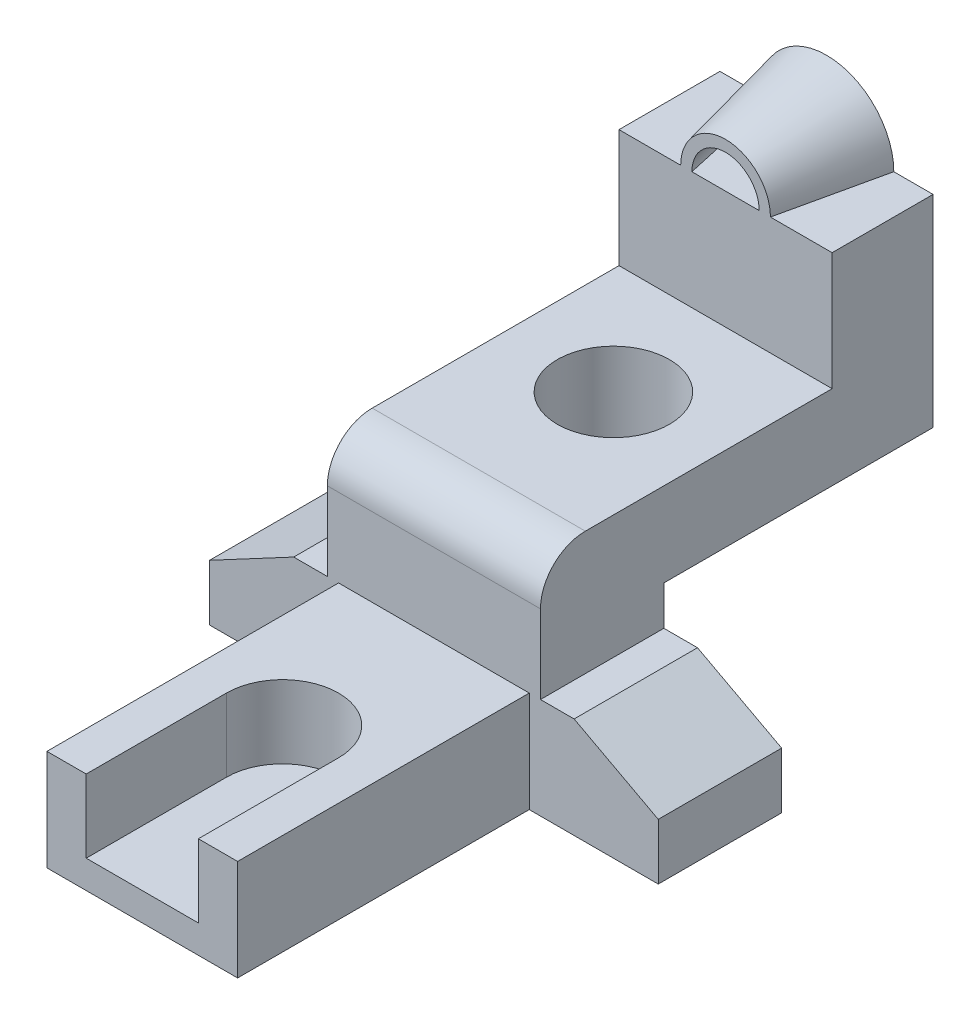
ISO-10303-21;
HEADER;
FILE_DESCRIPTION(('STEP AP214'),'2;1');
FILE_NAME('part.step','',(''),(''),'','','');
FILE_SCHEMA(('AUTOMOTIVE_DESIGN { 1 0 10303 214 1 1 1 1 }'));
ENDSEC;
DATA;
#1=APPLICATION_CONTEXT('core data for automotive mechanical design processes');
#2=APPLICATION_PROTOCOL_DEFINITION('international standard','automotive_design',2000,#1);
#3=PRODUCT_CONTEXT('',#1,'mechanical');
#4=PRODUCT('Part','Part','',(#3));
#5=PRODUCT_RELATED_PRODUCT_CATEGORY('part','',(#4));
#6=PRODUCT_DEFINITION_FORMATION('','',#4);
#7=PRODUCT_DEFINITION_CONTEXT('part definition',#1,'design');
#8=PRODUCT_DEFINITION('design','',#6,#7);
#9=PRODUCT_DEFINITION_SHAPE('','',#8);
#10=(LENGTH_UNIT() NAMED_UNIT(*) SI_UNIT(.MILLI.,.METRE.));
#11=(NAMED_UNIT(*) PLANE_ANGLE_UNIT() SI_UNIT($,.RADIAN.));
#12=(NAMED_UNIT(*) SI_UNIT($,.STERADIAN.) SOLID_ANGLE_UNIT());
#13=UNCERTAINTY_MEASURE_WITH_UNIT(LENGTH_MEASURE(1.E-05),#10,'distance_accuracy_value','');
#14=(GEOMETRIC_REPRESENTATION_CONTEXT(3) GLOBAL_UNCERTAINTY_ASSIGNED_CONTEXT((#13)) GLOBAL_UNIT_ASSIGNED_CONTEXT((#10,
#11,#12)) REPRESENTATION_CONTEXT('',''));
#15=CARTESIAN_POINT('',(0.,0.,0.));
#16=DIRECTION('',(0.,0.,1.));
#17=DIRECTION('',(1.,0.,0.));
#18=AXIS2_PLACEMENT_3D('',#15,#16,#17);
#19=CARTESIAN_POINT('',(40.,61.,-52.));
#20=DIRECTION('',(0.,-1.,0.));
#21=DIRECTION('',(0.,0.,-1.));
#22=AXIS2_PLACEMENT_3D('',#19,#20,#21);
#23=PLANE('',#22);
#24=DIRECTION('',(-1.,0.,0.));
#25=VECTOR('',#24,1.);
#26=CARTESIAN_POINT('',(40.,61.,-70.));
#27=LINE('',#26,#25);
#28=CARTESIAN_POINT('',(10.,61.,-70.));
#29=VERTEX_POINT('',#28);
#30=CARTESIAN_POINT('',(-10.,61.,-70.));
#31=VERTEX_POINT('',#30);
#32=EDGE_CURVE('E257',#29,#31,#27,.T.);
#33=ORIENTED_EDGE('',*,*,#32,.T.);
#34=DIRECTION('',(-0.216930457818657,0.,-0.976187060183953));
#35=VECTOR('',#34,1.);
#36=CARTESIAN_POINT('',(0.,61.,-25.0000000000001));
#37=LINE('',#36,#35);
#38=CARTESIAN_POINT('',(-6.,61.,-52.));
#39=VERTEX_POINT('',#38);
#40=EDGE_CURVE('E473',#31,#39,#37,.F.);
#41=ORIENTED_EDGE('',*,*,#40,.T.);
#42=DIRECTION('',(-1.,0.,0.));
#43=VECTOR('',#42,1.);
#44=CARTESIAN_POINT('',(40.,61.,-52.));
#45=LINE('',#44,#43);
#46=CARTESIAN_POINT('',(6.,61.,-52.));
#47=VERTEX_POINT('',#46);
#48=EDGE_CURVE('E272',#47,#39,#45,.T.);
#49=ORIENTED_EDGE('',*,*,#48,.F.);
#50=DIRECTION('',(-0.216930457818657,0.,0.976187060183953));
#51=VECTOR('',#50,1.);
#52=CARTESIAN_POINT('',(0.,61.,-25.0000000000001));
#53=LINE('',#52,#51);
#54=EDGE_CURVE('E489',#47,#29,#53,.F.);
#55=ORIENTED_EDGE('',*,*,#54,.T.);
#56=EDGE_LOOP('',(#33,#41,#49,#55));
#57=FACE_BOUND('',#56,.T.);
#58=ADVANCED_FACE('F45',(#57),#23,.F.);
#59=CARTESIAN_POINT('',(-8.,61.,-52.));
#60=VERTEX_POINT('',#59);
#61=CARTESIAN_POINT('',(-19.,61.,-52.));
#62=VERTEX_POINT('',#61);
#63=EDGE_CURVE('E273',#60,#62,#45,.T.);
#64=ORIENTED_EDGE('',*,*,#63,.F.);
#65=DIRECTION('',(-0.216930457818657,0.,-0.976187060183953));
#66=VECTOR('',#65,1.);
#67=CARTESIAN_POINT('',(0.,61.,-16.0000000000001));
#68=LINE('',#67,#66);
#69=CARTESIAN_POINT('',(-12.,61.,-70.));
#70=VERTEX_POINT('',#69);
#71=EDGE_CURVE('E237',#60,#70,#68,.T.);
#72=ORIENTED_EDGE('',*,*,#71,.T.);
#73=CARTESIAN_POINT('',(-19.,61.,-70.));
#74=VERTEX_POINT('',#73);
#75=EDGE_CURVE('E248',#70,#74,#27,.T.);
#76=ORIENTED_EDGE('',*,*,#75,.T.);
#77=DIRECTION('',(0.,0.,1.));
#78=VECTOR('',#77,1.);
#79=CARTESIAN_POINT('',(-19.,61.,-80.));
#80=LINE('',#79,#78);
#81=EDGE_CURVE('E357',#74,#62,#80,.T.);
#82=ORIENTED_EDGE('',*,*,#81,.T.);
#83=EDGE_LOOP('',(#64,#72,#76,#82));
#84=FACE_BOUND('',#83,.T.);
#85=ADVANCED_FACE('F580',(#84),#23,.F.);
#86=CARTESIAN_POINT('',(40.,0.,0.));
#87=DIRECTION('',(0.,0.,-1.));
#88=DIRECTION('',(-1.,0.,0.));
#89=AXIS2_PLACEMENT_3D('',#86,#87,#88);
#90=PLANE('',#89);
#91=DIRECTION('',(0.,-1.,0.));
#92=VECTOR('',#91,1.);
#93=CARTESIAN_POINT('',(19.,61.,0.));
#94=LINE('',#93,#92);
#95=CARTESIAN_POINT('',(19.,32.,0.));
#96=VERTEX_POINT('',#95);
#97=CARTESIAN_POINT('',(19.,18.,0.));
#98=VERTEX_POINT('',#97);
#99=EDGE_CURVE('E358',#96,#98,#94,.T.);
#100=ORIENTED_EDGE('',*,*,#99,.F.);
#101=DIRECTION('',(-1.,0.,0.));
#102=VECTOR('',#101,1.);
#103=CARTESIAN_POINT('',(40.,32.,0.));
#104=LINE('',#103,#102);
#105=CARTESIAN_POINT('',(-19.,32.,0.));
#106=VERTEX_POINT('',#105);
#107=EDGE_CURVE('E518',#96,#106,#104,.T.);
#108=ORIENTED_EDGE('',*,*,#107,.T.);
#109=DIRECTION('',(0.,1.,0.));
#110=VECTOR('',#109,1.);
#111=CARTESIAN_POINT('',(-19.,61.,0.));
#112=LINE('',#111,#110);
#113=CARTESIAN_POINT('',(-19.,18.,0.));
#114=VERTEX_POINT('',#113);
#115=EDGE_CURVE('E377',#114,#106,#112,.T.);
#116=ORIENTED_EDGE('',*,*,#115,.F.);
#117=DIRECTION('',(1.,0.,0.));
#118=VECTOR('',#117,1.);
#119=CARTESIAN_POINT('',(-40.,18.,0.));
#120=LINE('',#119,#118);
#121=CARTESIAN_POINT('',(-25.,18.,0.));
#122=VERTEX_POINT('',#121);
#123=EDGE_CURVE('E361',#122,#114,#120,.T.);
#124=ORIENTED_EDGE('',*,*,#123,.F.);
#125=DIRECTION('',(-0.882352941176471,-0.470588235294118,0.));
#126=VECTOR('',#125,1.);
#127=CARTESIAN_POINT('',(-25.,18.,0.));
#128=LINE('',#127,#126);
#129=CARTESIAN_POINT('',(-40.,10.,0.));
#130=VERTEX_POINT('',#129);
#131=EDGE_CURVE('E400',#122,#130,#128,.T.);
#132=ORIENTED_EDGE('',*,*,#131,.T.);
#133=DIRECTION('',(0.,-1.,0.));
#134=VECTOR('',#133,1.);
#135=CARTESIAN_POINT('',(-40.,0.,0.));
#136=LINE('',#135,#134);
#137=CARTESIAN_POINT('',(-40.,0.,0.));
#138=VERTEX_POINT('',#137);
#139=EDGE_CURVE('E293',#130,#138,#136,.T.);
#140=ORIENTED_EDGE('',*,*,#139,.T.);
#141=DIRECTION('',(-1.,0.,0.));
#142=VECTOR('',#141,1.);
#143=CARTESIAN_POINT('',(40.,0.,0.));
#144=LINE('',#143,#142);
#145=CARTESIAN_POINT('',(-17.,0.,0.));
#146=VERTEX_POINT('',#145);
#147=EDGE_CURVE('E290',#146,#138,#144,.T.);
#148=ORIENTED_EDGE('',*,*,#147,.F.);
#149=DIRECTION('',(0.,-1.,0.));
#150=VECTOR('',#149,1.);
#151=CARTESIAN_POINT('',(-17.,0.,0.));
#152=LINE('',#151,#150);
#153=CARTESIAN_POINT('',(-17.,18.,0.));
#154=VERTEX_POINT('',#153);
#155=EDGE_CURVE('E430',#154,#146,#152,.T.);
#156=ORIENTED_EDGE('',*,*,#155,.F.);
#157=DIRECTION('',(-1.,0.,0.));
#158=VECTOR('',#157,1.);
#159=CARTESIAN_POINT('',(-17.,18.,0.));
#160=LINE('',#159,#158);
#161=CARTESIAN_POINT('',(17.,18.,0.));
#162=VERTEX_POINT('',#161);
#163=EDGE_CURVE('E421',#162,#154,#160,.T.);
#164=ORIENTED_EDGE('',*,*,#163,.F.);
#165=DIRECTION('',(0.,1.,0.));
#166=VECTOR('',#165,1.);
#167=CARTESIAN_POINT('',(17.,0.,0.));
#168=LINE('',#167,#166);
#169=CARTESIAN_POINT('',(17.,0.,0.));
#170=VERTEX_POINT('',#169);
#171=EDGE_CURVE('E426',#170,#162,#168,.T.);
#172=ORIENTED_EDGE('',*,*,#171,.F.);
#173=CARTESIAN_POINT('',(40.,0.,0.));
#174=VERTEX_POINT('',#173);
#175=EDGE_CURVE('E286',#174,#170,#144,.T.);
#176=ORIENTED_EDGE('',*,*,#175,.F.);
#177=DIRECTION('',(0.,-1.,0.));
#178=VECTOR('',#177,1.);
#179=CARTESIAN_POINT('',(40.,0.,0.));
#180=LINE('',#179,#178);
#181=CARTESIAN_POINT('',(40.,10.,0.));
#182=VERTEX_POINT('',#181);
#183=EDGE_CURVE('E307',#182,#174,#180,.T.);
#184=ORIENTED_EDGE('',*,*,#183,.F.);
#185=DIRECTION('',(0.882352941176471,-0.470588235294118,0.));
#186=VECTOR('',#185,1.);
#187=CARTESIAN_POINT('',(25.,18.,0.));
#188=LINE('',#187,#186);
#189=CARTESIAN_POINT('',(25.,18.,0.));
#190=VERTEX_POINT('',#189);
#191=EDGE_CURVE('E391',#190,#182,#188,.T.);
#192=ORIENTED_EDGE('',*,*,#191,.F.);
#193=DIRECTION('',(1.,0.,0.));
#194=VECTOR('',#193,1.);
#195=CARTESIAN_POINT('',(40.,18.,0.));
#196=LINE('',#195,#194);
#197=EDGE_CURVE('E362',#98,#190,#196,.T.);
#198=ORIENTED_EDGE('',*,*,#197,.F.);
#199=EDGE_LOOP('',(#100,#108,#116,#124,#132,#140,#148,#156,#164,#172,#176,#184,#192,#198));
#200=FACE_BOUND('',#199,.T.);
#201=ADVANCED_FACE('F553',(#200),#90,.F.);
#202=CARTESIAN_POINT('',(40.,25.,-22.));
#203=DIRECTION('',(0.,0.,1.));
#204=DIRECTION('',(0.,-1.,0.));
#205=AXIS2_PLACEMENT_3D('',#202,#203,#204);
#206=PLANE('',#205);
#207=DIRECTION('',(-1.,0.,0.));
#208=VECTOR('',#207,1.);
#209=CARTESIAN_POINT('',(40.,0.,-22.));
#210=LINE('',#209,#208);
#211=CARTESIAN_POINT('',(40.,0.,-22.));
#212=VERTEX_POINT('',#211);
#213=CARTESIAN_POINT('',(-40.,0.,-22.));
#214=VERTEX_POINT('',#213);
#215=EDGE_CURVE('E529',#212,#214,#210,.T.);
#216=ORIENTED_EDGE('',*,*,#215,.T.);
#217=DIRECTION('',(0.,1.,0.));
#218=VECTOR('',#217,1.);
#219=CARTESIAN_POINT('',(-40.,25.,-22.));
#220=LINE('',#219,#218);
#221=CARTESIAN_POINT('',(-40.,10.,-22.));
#222=VERTEX_POINT('',#221);
#223=EDGE_CURVE('E298',#214,#222,#220,.T.);
#224=ORIENTED_EDGE('',*,*,#223,.T.);
#225=DIRECTION('',(-0.882352941176471,-0.470588235294118,0.));
#226=VECTOR('',#225,1.);
#227=CARTESIAN_POINT('',(28.5121107266436,46.5397923875432,-22.));
#228=LINE('',#227,#226);
#229=CARTESIAN_POINT('',(-25.,18.,-22.));
#230=VERTEX_POINT('',#229);
#231=EDGE_CURVE('E394',#230,#222,#228,.T.);
#232=ORIENTED_EDGE('',*,*,#231,.F.);
#233=DIRECTION('',(1.,0.,0.));
#234=VECTOR('',#233,1.);
#235=CARTESIAN_POINT('',(40.,18.,-22.));
#236=LINE('',#235,#234);
#237=CARTESIAN_POINT('',(-19.,18.,-22.));
#238=VERTEX_POINT('',#237);
#239=EDGE_CURVE('E354',#230,#238,#236,.T.);
#240=ORIENTED_EDGE('',*,*,#239,.T.);
#241=DIRECTION('',(0.,1.,0.));
#242=VECTOR('',#241,1.);
#243=CARTESIAN_POINT('',(-19.,25.,-22.));
#244=LINE('',#243,#242);
#245=CARTESIAN_POINT('',(-19.,25.,-22.));
#246=VERTEX_POINT('',#245);
#247=EDGE_CURVE('E306',#238,#246,#244,.T.);
#248=ORIENTED_EDGE('',*,*,#247,.T.);
#249=DIRECTION('',(-1.,0.,0.));
#250=VECTOR('',#249,1.);
#251=CARTESIAN_POINT('',(40.,25.,-22.));
#252=LINE('',#251,#250);
#253=CARTESIAN_POINT('',(0.,25.,-22.));
#254=VERTEX_POINT('',#253);
#255=EDGE_CURVE('E262',#254,#246,#252,.T.);
#256=ORIENTED_EDGE('',*,*,#255,.F.);
#257=CARTESIAN_POINT('',(19.,25.,-22.));
#258=VERTEX_POINT('',#257);
#259=EDGE_CURVE('E531',#258,#254,#252,.T.);
#260=ORIENTED_EDGE('',*,*,#259,.F.);
#261=DIRECTION('',(0.,-1.,0.));
#262=VECTOR('',#261,1.);
#263=CARTESIAN_POINT('',(19.,25.,-22.));
#264=LINE('',#263,#262);
#265=CARTESIAN_POINT('',(19.,18.,-22.));
#266=VERTEX_POINT('',#265);
#267=EDGE_CURVE('E333',#258,#266,#264,.T.);
#268=ORIENTED_EDGE('',*,*,#267,.T.);
#269=DIRECTION('',(1.,0.,0.));
#270=VECTOR('',#269,1.);
#271=CARTESIAN_POINT('',(40.,18.,-22.));
#272=LINE('',#271,#270);
#273=CARTESIAN_POINT('',(25.,18.,-22.));
#274=VERTEX_POINT('',#273);
#275=EDGE_CURVE('E350',#266,#274,#272,.T.);
#276=ORIENTED_EDGE('',*,*,#275,.T.);
#277=DIRECTION('',(0.882352941176471,-0.470588235294118,0.));
#278=VECTOR('',#277,1.);
#279=CARTESIAN_POINT('',(33.7716262975779,13.3217993079585,-22.));
#280=LINE('',#279,#278);
#281=CARTESIAN_POINT('',(40.,10.,-22.));
#282=VERTEX_POINT('',#281);
#283=EDGE_CURVE('E370',#274,#282,#280,.T.);
#284=ORIENTED_EDGE('',*,*,#283,.T.);
#285=DIRECTION('',(0.,1.,0.));
#286=VECTOR('',#285,1.);
#287=CARTESIAN_POINT('',(40.,25.,-22.));
#288=LINE('',#287,#286);
#289=EDGE_CURVE('E310',#212,#282,#288,.T.);
#290=ORIENTED_EDGE('',*,*,#289,.F.);
#291=EDGE_LOOP('',(#216,#224,#232,#240,#248,#256,#260,#268,#276,#284,#290));
#292=FACE_BOUND('',#291,.T.);
#293=ADVANCED_FACE('F543',(#292),#206,.F.);
#294=CARTESIAN_POINT('',(-40.,0.,0.));
#295=DIRECTION('',(-1.,0.,0.));
#296=DIRECTION('',(0.,0.,1.));
#297=AXIS2_PLACEMENT_3D('',#294,#295,#296);
#298=PLANE('',#297);
#299=ORIENTED_EDGE('',*,*,#139,.F.);
#300=DIRECTION('',(0.,0.,1.));
#301=VECTOR('',#300,1.);
#302=CARTESIAN_POINT('',(-40.,10.,-80.));
#303=LINE('',#302,#301);
#304=EDGE_CURVE('E397',#222,#130,#303,.T.);
#305=ORIENTED_EDGE('',*,*,#304,.F.);
#306=ORIENTED_EDGE('',*,*,#223,.F.);
#307=DIRECTION('',(0.,0.,-1.));
#308=VECTOR('',#307,1.);
#309=CARTESIAN_POINT('',(-40.,0.,-22.));
#310=LINE('',#309,#308);
#311=EDGE_CURVE('E302',#138,#214,#310,.T.);
#312=ORIENTED_EDGE('',*,*,#311,.F.);
#313=EDGE_LOOP('',(#299,#305,#306,#312));
#314=FACE_BOUND('',#313,.T.);
#315=ADVANCED_FACE('F599',(#314),#298,.T.);
#316=CARTESIAN_POINT('',(-40.,18.,-80.));
#317=DIRECTION('',(0.,-1.,0.));
#318=DIRECTION('',(1.,0.,0.));
#319=AXIS2_PLACEMENT_3D('',#316,#317,#318);
#320=PLANE('',#319);
#321=DIRECTION('',(0.,0.,-1.));
#322=VECTOR('',#321,1.);
#323=CARTESIAN_POINT('',(-25.,18.,-80.));
#324=LINE('',#323,#322);
#325=EDGE_CURVE('E516',#122,#230,#324,.T.);
#326=ORIENTED_EDGE('',*,*,#325,.F.);
#327=ORIENTED_EDGE('',*,*,#123,.T.);
#328=DIRECTION('',(0.,0.,1.));
#329=VECTOR('',#328,1.);
#330=CARTESIAN_POINT('',(-19.,18.,-80.));
#331=LINE('',#330,#329);
#332=EDGE_CURVE('E373',#238,#114,#331,.T.);
#333=ORIENTED_EDGE('',*,*,#332,.F.);
#334=ORIENTED_EDGE('',*,*,#239,.F.);
#335=EDGE_LOOP('',(#326,#327,#333,#334));
#336=FACE_BOUND('',#335,.T.);
#337=ADVANCED_FACE('F548',(#336),#320,.F.);
#338=CARTESIAN_POINT('',(40.,0.,-22.));
#339=DIRECTION('',(0.,1.,0.));
#340=DIRECTION('',(0.,0.,1.));
#341=AXIS2_PLACEMENT_3D('',#338,#339,#340);
#342=PLANE('',#341);
#343=ORIENTED_EDGE('',*,*,#311,.T.);
#344=ORIENTED_EDGE('',*,*,#215,.F.);
#345=DIRECTION('',(0.,0.,-1.));
#346=VECTOR('',#345,1.);
#347=CARTESIAN_POINT('',(40.,0.,-22.));
#348=LINE('',#347,#346);
#349=EDGE_CURVE('E297',#174,#212,#348,.T.);
#350=ORIENTED_EDGE('',*,*,#349,.F.);
#351=ORIENTED_EDGE('',*,*,#175,.T.);
#352=DIRECTION('',(0.,0.,-1.));
#353=VECTOR('',#352,1.);
#354=CARTESIAN_POINT('',(17.,0.,52.));
#355=LINE('',#354,#353);
#356=CARTESIAN_POINT('',(17.,0.,52.));
#357=VERTEX_POINT('',#356);
#358=EDGE_CURVE('E408',#357,#170,#355,.T.);
#359=ORIENTED_EDGE('',*,*,#358,.F.);
#360=DIRECTION('',(1.,0.,0.));
#361=VECTOR('',#360,1.);
#362=CARTESIAN_POINT('',(-17.,0.,52.));
#363=LINE('',#362,#361);
#364=CARTESIAN_POINT('',(-17.,0.,52.));
#365=VERTEX_POINT('',#364);
#366=EDGE_CURVE('E442',#365,#357,#363,.T.);
#367=ORIENTED_EDGE('',*,*,#366,.F.);
#368=DIRECTION('',(0.,0.,-1.));
#369=VECTOR('',#368,1.);
#370=CARTESIAN_POINT('',(-17.,0.,52.));
#371=LINE('',#370,#369);
#372=EDGE_CURVE('E404',#365,#146,#371,.T.);
#373=ORIENTED_EDGE('',*,*,#372,.T.);
#374=ORIENTED_EDGE('',*,*,#147,.T.);
#375=EDGE_LOOP('',(#343,#344,#350,#351,#359,#367,#373,#374));
#376=FACE_BOUND('',#375,.T.);
#377=ADVANCED_FACE('F595',(#376),#342,.F.);
#378=CARTESIAN_POINT('',(40.,25.,-70.));
#379=DIRECTION('',(0.,1.,0.));
#380=DIRECTION('',(0.,0.,1.));
#381=AXIS2_PLACEMENT_3D('',#378,#379,#380);
#382=PLANE('',#381);
#383=ORIENTED_EDGE('',*,*,#259,.T.);
#384=CARTESIAN_POINT('',(0.,25.,-32.));
#385=DIRECTION('',(0.,1.,0.));
#386=DIRECTION('',(0.,0.,1.));
#387=AXIS2_PLACEMENT_3D('',#384,#385,#386);
#388=CIRCLE('',#387,10.);
#389=EDGE_CURVE('E502',#254,#254,#388,.T.);
#390=ORIENTED_EDGE('',*,*,#389,.T.);
#391=ORIENTED_EDGE('',*,*,#255,.T.);
#392=DIRECTION('',(0.,0.,-1.));
#393=VECTOR('',#392,1.);
#394=CARTESIAN_POINT('',(-19.,25.,-70.));
#395=LINE('',#394,#393);
#396=CARTESIAN_POINT('',(-19.,25.,-70.));
#397=VERTEX_POINT('',#396);
#398=EDGE_CURVE('E320',#246,#397,#395,.T.);
#399=ORIENTED_EDGE('',*,*,#398,.T.);
#400=DIRECTION('',(-1.,0.,0.));
#401=VECTOR('',#400,1.);
#402=CARTESIAN_POINT('',(40.,25.,-70.));
#403=LINE('',#402,#401);
#404=CARTESIAN_POINT('',(19.,25.,-70.));
#405=VERTEX_POINT('',#404);
#406=EDGE_CURVE('E256',#405,#397,#403,.T.);
#407=ORIENTED_EDGE('',*,*,#406,.F.);
#408=DIRECTION('',(0.,0.,1.));
#409=VECTOR('',#408,1.);
#410=CARTESIAN_POINT('',(19.,25.,-70.));
#411=LINE('',#410,#409);
#412=EDGE_CURVE('E337',#405,#258,#411,.T.);
#413=ORIENTED_EDGE('',*,*,#412,.T.);
#414=EDGE_LOOP('',(#383,#390,#391,#399,#407,#413));
#415=FACE_BOUND('',#414,.T.);
#416=ADVANCED_FACE('F536',(#415),#382,.F.);
#417=CARTESIAN_POINT('',(40.,61.,-70.));
#418=DIRECTION('',(0.,0.,1.));
#419=DIRECTION('',(0.,-1.,0.));
#420=AXIS2_PLACEMENT_3D('',#417,#418,#419);
#421=PLANE('',#420);
#422=ORIENTED_EDGE('',*,*,#75,.F.);
#423=CARTESIAN_POINT('',(0.,61.,-70.));
#424=DIRECTION('',(0.,0.,1.));
#425=DIRECTION('',(0.,-1.,0.));
#426=AXIS2_PLACEMENT_3D('',#423,#424,#425);
#427=CIRCLE('',#426,12.);
#428=CARTESIAN_POINT('',(12.,61.,-70.));
#429=VERTEX_POINT('',#428);
#430=EDGE_CURVE('E228',#429,#70,#427,.T.);
#431=ORIENTED_EDGE('',*,*,#430,.F.);
#432=CARTESIAN_POINT('',(19.,61.,-70.));
#433=VERTEX_POINT('',#432);
#434=EDGE_CURVE('E246',#433,#429,#27,.T.);
#435=ORIENTED_EDGE('',*,*,#434,.F.);
#436=DIRECTION('',(0.,-1.,0.));
#437=VECTOR('',#436,1.);
#438=CARTESIAN_POINT('',(19.,61.,-70.));
#439=LINE('',#438,#437);
#440=EDGE_CURVE('E341',#433,#405,#439,.T.);
#441=ORIENTED_EDGE('',*,*,#440,.T.);
#442=ORIENTED_EDGE('',*,*,#406,.T.);
#443=DIRECTION('',(0.,1.,0.));
#444=VECTOR('',#443,1.);
#445=CARTESIAN_POINT('',(-19.,61.,-70.));
#446=LINE('',#445,#444);
#447=EDGE_CURVE('E324',#397,#74,#446,.T.);
#448=ORIENTED_EDGE('',*,*,#447,.T.);
#449=EDGE_LOOP('',(#422,#431,#435,#441,#442,#448));
#450=FACE_BOUND('',#449,.T.);
#451=CARTESIAN_POINT('',(0.,61.,-70.));
#452=DIRECTION('',(0.,0.,1.));
#453=DIRECTION('',(0.,-1.,0.));
#454=AXIS2_PLACEMENT_3D('',#451,#452,#453);
#455=CIRCLE('',#454,10.);
#456=EDGE_CURVE('E250',#29,#31,#455,.T.);
#457=ORIENTED_EDGE('',*,*,#456,.T.);
#458=ORIENTED_EDGE('',*,*,#32,.F.);
#459=EDGE_LOOP('',(#457,#458));
#460=FACE_BOUND('',#459,.T.);
#461=ADVANCED_FACE('F243',(#450,#460),#421,.F.);
#462=ORIENTED_EDGE('',*,*,#434,.T.);
#463=DIRECTION('',(-0.216930457818657,0.,0.976187060183953));
#464=VECTOR('',#463,1.);
#465=CARTESIAN_POINT('',(0.,61.,-16.0000000000001));
#466=LINE('',#465,#464);
#467=CARTESIAN_POINT('',(8.,61.,-52.));
#468=VERTEX_POINT('',#467);
#469=EDGE_CURVE('E225',#429,#468,#466,.T.);
#470=ORIENTED_EDGE('',*,*,#469,.T.);
#471=CARTESIAN_POINT('',(19.,61.,-52.));
#472=VERTEX_POINT('',#471);
#473=EDGE_CURVE('E267',#472,#468,#45,.T.);
#474=ORIENTED_EDGE('',*,*,#473,.F.);
#475=DIRECTION('',(0.,0.,1.));
#476=VECTOR('',#475,1.);
#477=CARTESIAN_POINT('',(19.,61.,-80.));
#478=LINE('',#477,#476);
#479=EDGE_CURVE('E254',#433,#472,#478,.T.);
#480=ORIENTED_EDGE('',*,*,#479,.F.);
#481=EDGE_LOOP('',(#462,#470,#474,#480));
#482=FACE_BOUND('',#481,.T.);
#483=ADVANCED_FACE('F253',(#482),#23,.F.);
#484=CARTESIAN_POINT('',(40.,40.,-52.));
#485=DIRECTION('',(0.,0.,-1.));
#486=DIRECTION('',(0.,1.,0.));
#487=AXIS2_PLACEMENT_3D('',#484,#485,#486);
#488=PLANE('',#487);
#489=CARTESIAN_POINT('',(0.,61.,-52.));
#490=DIRECTION('',(0.,0.,1.));
#491=DIRECTION('',(0.,-1.,0.));
#492=AXIS2_PLACEMENT_3D('',#489,#490,#491);
#493=CIRCLE('',#492,6.);
#494=EDGE_CURVE('E238',#47,#39,#493,.T.);
#495=ORIENTED_EDGE('',*,*,#494,.F.);
#496=ORIENTED_EDGE('',*,*,#48,.T.);
#497=EDGE_LOOP('',(#495,#496));
#498=FACE_BOUND('',#497,.T.);
#499=ORIENTED_EDGE('',*,*,#473,.T.);
#500=CARTESIAN_POINT('',(0.,61.,-52.));
#501=DIRECTION('',(0.,0.,1.));
#502=DIRECTION('',(0.,-1.,0.));
#503=AXIS2_PLACEMENT_3D('',#500,#501,#502);
#504=CIRCLE('',#503,8.);
#505=EDGE_CURVE('E231',#468,#60,#504,.T.);
#506=ORIENTED_EDGE('',*,*,#505,.T.);
#507=ORIENTED_EDGE('',*,*,#63,.T.);
#508=DIRECTION('',(0.,-1.,0.));
#509=VECTOR('',#508,1.);
#510=CARTESIAN_POINT('',(-19.,40.,-52.));
#511=LINE('',#510,#509);
#512=CARTESIAN_POINT('',(-19.,40.,-52.));
#513=VERTEX_POINT('',#512);
#514=EDGE_CURVE('E327',#62,#513,#511,.T.);
#515=ORIENTED_EDGE('',*,*,#514,.T.);
#516=DIRECTION('',(-1.,0.,0.));
#517=VECTOR('',#516,1.);
#518=CARTESIAN_POINT('',(40.,40.,-52.));
#519=LINE('',#518,#517);
#520=CARTESIAN_POINT('',(19.,40.,-52.));
#521=VERTEX_POINT('',#520);
#522=EDGE_CURVE('E280',#521,#513,#519,.T.);
#523=ORIENTED_EDGE('',*,*,#522,.F.);
#524=DIRECTION('',(0.,1.,0.));
#525=VECTOR('',#524,1.);
#526=CARTESIAN_POINT('',(19.,40.,-52.));
#527=LINE('',#526,#525);
#528=EDGE_CURVE('E344',#521,#472,#527,.T.);
#529=ORIENTED_EDGE('',*,*,#528,.T.);
#530=EDGE_LOOP('',(#499,#506,#507,#515,#523,#529));
#531=FACE_BOUND('',#530,.T.);
#532=ADVANCED_FACE('F565',(#498,#531),#488,.F.);
#533=CARTESIAN_POINT('',(40.,40.,0.));
#534=DIRECTION('',(0.,-1.,0.));
#535=DIRECTION('',(0.,0.,-1.));
#536=AXIS2_PLACEMENT_3D('',#533,#534,#535);
#537=PLANE('',#536);
#538=CARTESIAN_POINT('',(0.,40.,-32.));
#539=DIRECTION('',(0.,1.,0.));
#540=DIRECTION('',(0.,0.,1.));
#541=AXIS2_PLACEMENT_3D('',#538,#539,#540);
#542=CIRCLE('',#541,10.);
#543=CARTESIAN_POINT('',(0.,40.,-22.));
#544=VERTEX_POINT('',#543);
#545=EDGE_CURVE('E503',#544,#544,#542,.T.);
#546=ORIENTED_EDGE('',*,*,#545,.F.);
#547=EDGE_LOOP('',(#546));
#548=FACE_BOUND('',#547,.T.);
#549=DIRECTION('',(0.,0.,1.));
#550=VECTOR('',#549,1.);
#551=CARTESIAN_POINT('',(-19.,40.,0.));
#552=LINE('',#551,#550);
#553=CARTESIAN_POINT('',(-19.,40.,-8.));
#554=VERTEX_POINT('',#553);
#555=EDGE_CURVE('E330',#513,#554,#552,.T.);
#556=ORIENTED_EDGE('',*,*,#555,.T.);
#557=DIRECTION('',(-1.,0.,0.));
#558=VECTOR('',#557,1.);
#559=CARTESIAN_POINT('',(40.,40.,-8.));
#560=LINE('',#559,#558);
#561=CARTESIAN_POINT('',(19.,40.,-8.));
#562=VERTEX_POINT('',#561);
#563=EDGE_CURVE('E54',#554,#562,#560,.F.);
#564=ORIENTED_EDGE('',*,*,#563,.T.);
#565=DIRECTION('',(0.,0.,-1.));
#566=VECTOR('',#565,1.);
#567=CARTESIAN_POINT('',(19.,40.,0.));
#568=LINE('',#567,#566);
#569=EDGE_CURVE('E347',#562,#521,#568,.T.);
#570=ORIENTED_EDGE('',*,*,#569,.T.);
#571=ORIENTED_EDGE('',*,*,#522,.T.);
#572=EDGE_LOOP('',(#556,#564,#570,#571));
#573=FACE_BOUND('',#572,.T.);
#574=ADVANCED_FACE('F562',(#548,#573),#537,.F.);
#575=CARTESIAN_POINT('',(40.,0.,0.));
#576=DIRECTION('',(-1.,0.,0.));
#577=DIRECTION('',(0.,0.,1.));
#578=AXIS2_PLACEMENT_3D('',#575,#576,#577);
#579=PLANE('',#578);
#580=ORIENTED_EDGE('',*,*,#289,.T.);
#581=DIRECTION('',(0.,0.,1.));
#582=VECTOR('',#581,1.);
#583=CARTESIAN_POINT('',(40.,10.,-80.));
#584=LINE('',#583,#582);
#585=EDGE_CURVE('E387',#282,#182,#584,.T.);
#586=ORIENTED_EDGE('',*,*,#585,.T.);
#587=ORIENTED_EDGE('',*,*,#183,.T.);
#588=ORIENTED_EDGE('',*,*,#349,.T.);
#589=EDGE_LOOP('',(#580,#586,#587,#588));
#590=FACE_BOUND('',#589,.T.);
#591=ADVANCED_FACE('F564',(#590),#579,.F.);
#592=CARTESIAN_POINT('',(-19.,61.,-80.));
#593=DIRECTION('',(1.,0.,0.));
#594=DIRECTION('',(0.,1.,0.));
#595=AXIS2_PLACEMENT_3D('',#592,#593,#594);
#596=PLANE('',#595);
#597=ORIENTED_EDGE('',*,*,#115,.T.);
#598=CARTESIAN_POINT('',(-19.,32.,-8.));
#599=DIRECTION('',(1.,0.,0.));
#600=DIRECTION('',(0.,1.,0.));
#601=AXIS2_PLACEMENT_3D('',#598,#599,#600);
#602=CIRCLE('',#601,8.);
#603=EDGE_CURVE('E68',#106,#554,#602,.F.);
#604=ORIENTED_EDGE('',*,*,#603,.T.);
#605=ORIENTED_EDGE('',*,*,#555,.F.);
#606=ORIENTED_EDGE('',*,*,#514,.F.);
#607=ORIENTED_EDGE('',*,*,#81,.F.);
#608=ORIENTED_EDGE('',*,*,#447,.F.);
#609=ORIENTED_EDGE('',*,*,#398,.F.);
#610=ORIENTED_EDGE('',*,*,#247,.F.);
#611=ORIENTED_EDGE('',*,*,#332,.T.);
#612=EDGE_LOOP('',(#597,#604,#605,#606,#607,#608,#609,#610,#611));
#613=FACE_BOUND('',#612,.T.);
#614=ADVANCED_FACE('F541',(#613),#596,.F.);
#615=CARTESIAN_POINT('',(19.,61.,-80.));
#616=DIRECTION('',(-1.,0.,0.));
#617=DIRECTION('',(0.,-1.,0.));
#618=AXIS2_PLACEMENT_3D('',#615,#616,#617);
#619=PLANE('',#618);
#620=ORIENTED_EDGE('',*,*,#569,.F.);
#621=CARTESIAN_POINT('',(19.,32.,-8.));
#622=DIRECTION('',(-1.,0.,0.));
#623=DIRECTION('',(0.,-1.,0.));
#624=AXIS2_PLACEMENT_3D('',#621,#622,#623);
#625=CIRCLE('',#624,8.);
#626=EDGE_CURVE('E11',#562,#96,#625,.F.);
#627=ORIENTED_EDGE('',*,*,#626,.T.);
#628=ORIENTED_EDGE('',*,*,#99,.T.);
#629=DIRECTION('',(0.,0.,1.));
#630=VECTOR('',#629,1.);
#631=CARTESIAN_POINT('',(19.,18.,-80.));
#632=LINE('',#631,#630);
#633=EDGE_CURVE('E366',#266,#98,#632,.T.);
#634=ORIENTED_EDGE('',*,*,#633,.F.);
#635=ORIENTED_EDGE('',*,*,#267,.F.);
#636=ORIENTED_EDGE('',*,*,#412,.F.);
#637=ORIENTED_EDGE('',*,*,#440,.F.);
#638=ORIENTED_EDGE('',*,*,#479,.T.);
#639=ORIENTED_EDGE('',*,*,#528,.F.);
#640=EDGE_LOOP('',(#620,#627,#628,#634,#635,#636,#637,#638,#639));
#641=FACE_BOUND('',#640,.T.);
#642=ADVANCED_FACE('F559',(#641),#619,.F.);
#643=CARTESIAN_POINT('',(40.,18.,-80.));
#644=DIRECTION('',(0.,-1.,0.));
#645=DIRECTION('',(1.,0.,0.));
#646=AXIS2_PLACEMENT_3D('',#643,#644,#645);
#647=PLANE('',#646);
#648=ORIENTED_EDGE('',*,*,#197,.T.);
#649=DIRECTION('',(0.,0.,-1.));
#650=VECTOR('',#649,1.);
#651=CARTESIAN_POINT('',(25.,18.,-80.));
#652=LINE('',#651,#650);
#653=EDGE_CURVE('E526',#190,#274,#652,.T.);
#654=ORIENTED_EDGE('',*,*,#653,.T.);
#655=ORIENTED_EDGE('',*,*,#275,.F.);
#656=ORIENTED_EDGE('',*,*,#633,.T.);
#657=EDGE_LOOP('',(#648,#654,#655,#656));
#658=FACE_BOUND('',#657,.T.);
#659=ADVANCED_FACE('F673',(#658),#647,.F.);
#660=CARTESIAN_POINT('',(25.,18.,-80.));
#661=DIRECTION('',(-0.470588235294118,-0.882352941176471,0.));
#662=DIRECTION('',(0.882352941176471,-0.470588235294118,0.));
#663=AXIS2_PLACEMENT_3D('',#660,#661,#662);
#664=PLANE('',#663);
#665=ORIENTED_EDGE('',*,*,#653,.F.);
#666=ORIENTED_EDGE('',*,*,#191,.T.);
#667=ORIENTED_EDGE('',*,*,#585,.F.);
#668=ORIENTED_EDGE('',*,*,#283,.F.);
#669=EDGE_LOOP('',(#665,#666,#667,#668));
#670=FACE_BOUND('',#669,.T.);
#671=ADVANCED_FACE('F669',(#670),#664,.F.);
#672=CARTESIAN_POINT('',(-25.,18.,-80.));
#673=DIRECTION('',(-0.470588235294118,0.882352941176471,0.));
#674=DIRECTION('',(-0.882352941176471,-0.470588235294118,0.));
#675=AXIS2_PLACEMENT_3D('',#672,#673,#674);
#676=PLANE('',#675);
#677=ORIENTED_EDGE('',*,*,#231,.T.);
#678=ORIENTED_EDGE('',*,*,#304,.T.);
#679=ORIENTED_EDGE('',*,*,#131,.F.);
#680=ORIENTED_EDGE('',*,*,#325,.T.);
#681=EDGE_LOOP('',(#677,#678,#679,#680));
#682=FACE_BOUND('',#681,.T.);
#683=ADVANCED_FACE('F666',(#682),#676,.T.);
#684=CARTESIAN_POINT('',(-17.,0.,52.));
#685=DIRECTION('',(1.,0.,0.));
#686=DIRECTION('',(0.,0.,-1.));
#687=AXIS2_PLACEMENT_3D('',#684,#685,#686);
#688=PLANE('',#687);
#689=ORIENTED_EDGE('',*,*,#155,.T.);
#690=ORIENTED_EDGE('',*,*,#372,.F.);
#691=DIRECTION('',(0.,-1.,0.));
#692=VECTOR('',#691,1.);
#693=CARTESIAN_POINT('',(-17.,0.,52.));
#694=LINE('',#693,#692);
#695=CARTESIAN_POINT('',(-17.,18.,52.));
#696=VERTEX_POINT('',#695);
#697=EDGE_CURVE('E425',#696,#365,#694,.T.);
#698=ORIENTED_EDGE('',*,*,#697,.F.);
#699=DIRECTION('',(0.,0.,-1.));
#700=VECTOR('',#699,1.);
#701=CARTESIAN_POINT('',(-17.,18.,52.));
#702=LINE('',#701,#700);
#703=EDGE_CURVE('E416',#696,#154,#702,.T.);
#704=ORIENTED_EDGE('',*,*,#703,.T.);
#705=EDGE_LOOP('',(#689,#690,#698,#704));
#706=FACE_BOUND('',#705,.T.);
#707=ADVANCED_FACE('F627',(#706),#688,.F.);
#708=CARTESIAN_POINT('',(17.,0.,52.));
#709=DIRECTION('',(-1.,0.,0.));
#710=DIRECTION('',(0.,0.,1.));
#711=AXIS2_PLACEMENT_3D('',#708,#709,#710);
#712=PLANE('',#711);
#713=ORIENTED_EDGE('',*,*,#171,.T.);
#714=DIRECTION('',(0.,0.,-1.));
#715=VECTOR('',#714,1.);
#716=CARTESIAN_POINT('',(17.,18.,52.));
#717=LINE('',#716,#715);
#718=CARTESIAN_POINT('',(17.,18.,52.));
#719=VERTEX_POINT('',#718);
#720=EDGE_CURVE('E412',#719,#162,#717,.T.);
#721=ORIENTED_EDGE('',*,*,#720,.F.);
#722=DIRECTION('',(0.,1.,0.));
#723=VECTOR('',#722,1.);
#724=CARTESIAN_POINT('',(17.,0.,52.));
#725=LINE('',#724,#723);
#726=EDGE_CURVE('E439',#357,#719,#725,.T.);
#727=ORIENTED_EDGE('',*,*,#726,.F.);
#728=ORIENTED_EDGE('',*,*,#358,.T.);
#729=EDGE_LOOP('',(#713,#721,#727,#728));
#730=FACE_BOUND('',#729,.T.);
#731=ADVANCED_FACE('F618',(#730),#712,.F.);
#732=CARTESIAN_POINT('',(-17.,18.,52.));
#733=DIRECTION('',(0.,-1.,0.));
#734=DIRECTION('',(0.,0.,-1.));
#735=AXIS2_PLACEMENT_3D('',#732,#733,#734);
#736=PLANE('',#735);
#737=CARTESIAN_POINT('',(0.,18.,27.));
#738=DIRECTION('',(0.,1.,0.));
#739=DIRECTION('',(0.,0.,1.));
#740=AXIS2_PLACEMENT_3D('',#737,#738,#739);
#741=CIRCLE('',#740,10.);
#742=CARTESIAN_POINT('',(10.,18.,27.));
#743=VERTEX_POINT('',#742);
#744=CARTESIAN_POINT('',(-10.,18.,27.));
#745=VERTEX_POINT('',#744);
#746=EDGE_CURVE('E469',#743,#745,#741,.T.);
#747=ORIENTED_EDGE('',*,*,#746,.F.);
#748=DIRECTION('',(0.,0.,-1.));
#749=VECTOR('',#748,1.);
#750=CARTESIAN_POINT('',(10.,18.,52.));
#751=LINE('',#750,#749);
#752=CARTESIAN_POINT('',(10.,18.,52.));
#753=VERTEX_POINT('',#752);
#754=EDGE_CURVE('E461',#753,#743,#751,.T.);
#755=ORIENTED_EDGE('',*,*,#754,.F.);
#756=DIRECTION('',(-1.,0.,0.));
#757=VECTOR('',#756,1.);
#758=CARTESIAN_POINT('',(-17.,18.,52.));
#759=LINE('',#758,#757);
#760=EDGE_CURVE('E420',#719,#753,#759,.T.);
#761=ORIENTED_EDGE('',*,*,#760,.F.);
#762=ORIENTED_EDGE('',*,*,#720,.T.);
#763=ORIENTED_EDGE('',*,*,#163,.T.);
#764=ORIENTED_EDGE('',*,*,#703,.F.);
#765=CARTESIAN_POINT('',(-10.,18.,52.));
#766=VERTEX_POINT('',#765);
#767=EDGE_CURVE('E438',#766,#696,#759,.T.);
#768=ORIENTED_EDGE('',*,*,#767,.F.);
#769=DIRECTION('',(0.,0.,1.));
#770=VECTOR('',#769,1.);
#771=CARTESIAN_POINT('',(-10.,18.,27.));
#772=LINE('',#771,#770);
#773=EDGE_CURVE('E466',#745,#766,#772,.T.);
#774=ORIENTED_EDGE('',*,*,#773,.F.);
#775=EDGE_LOOP('',(#747,#755,#761,#762,#763,#764,#768,#774));
#776=FACE_BOUND('',#775,.T.);
#777=ADVANCED_FACE('F631',(#776),#736,.F.);
#778=CARTESIAN_POINT('',(0.,0.,52.));
#779=DIRECTION('',(0.,0.,-1.));
#780=DIRECTION('',(-1.,0.,0.));
#781=AXIS2_PLACEMENT_3D('',#778,#779,#780);
#782=PLANE('',#781);
#783=ORIENTED_EDGE('',*,*,#760,.T.);
#784=DIRECTION('',(0.,1.,0.));
#785=VECTOR('',#784,1.);
#786=CARTESIAN_POINT('',(10.,5.,52.));
#787=LINE('',#786,#785);
#788=CARTESIAN_POINT('',(10.,5.,52.));
#789=VERTEX_POINT('',#788);
#790=EDGE_CURVE('E456',#789,#753,#787,.T.);
#791=ORIENTED_EDGE('',*,*,#790,.F.);
#792=DIRECTION('',(1.,0.,0.));
#793=VECTOR('',#792,1.);
#794=CARTESIAN_POINT('',(-10.,5.,52.));
#795=LINE('',#794,#793);
#796=CARTESIAN_POINT('',(-10.,5.,52.));
#797=VERTEX_POINT('',#796);
#798=EDGE_CURVE('E477',#797,#789,#795,.T.);
#799=ORIENTED_EDGE('',*,*,#798,.F.);
#800=DIRECTION('',(0.,1.,0.));
#801=VECTOR('',#800,1.);
#802=CARTESIAN_POINT('',(-10.,5.,52.));
#803=LINE('',#802,#801);
#804=EDGE_CURVE('E451',#797,#766,#803,.T.);
#805=ORIENTED_EDGE('',*,*,#804,.T.);
#806=ORIENTED_EDGE('',*,*,#767,.T.);
#807=ORIENTED_EDGE('',*,*,#697,.T.);
#808=ORIENTED_EDGE('',*,*,#366,.T.);
#809=ORIENTED_EDGE('',*,*,#726,.T.);
#810=EDGE_LOOP('',(#783,#791,#799,#805,#806,#807,#808,#809));
#811=FACE_BOUND('',#810,.T.);
#812=ADVANCED_FACE('F622',(#811),#782,.F.);
#813=CARTESIAN_POINT('',(0.,5.,27.));
#814=DIRECTION('',(0.,1.,0.));
#815=DIRECTION('',(0.,0.,1.));
#816=AXIS2_PLACEMENT_3D('',#813,#814,#815);
#817=CYLINDRICAL_SURFACE('',#816,10.);
#818=ORIENTED_EDGE('',*,*,#746,.T.);
#819=DIRECTION('',(0.,1.,0.));
#820=VECTOR('',#819,1.);
#821=CARTESIAN_POINT('',(-10.,5.,27.));
#822=LINE('',#821,#820);
#823=CARTESIAN_POINT('',(-10.,5.,27.));
#824=VERTEX_POINT('',#823);
#825=EDGE_CURVE('E448',#824,#745,#822,.T.);
#826=ORIENTED_EDGE('',*,*,#825,.F.);
#827=CARTESIAN_POINT('',(0.,5.,27.));
#828=DIRECTION('',(0.,1.,0.));
#829=DIRECTION('',(0.,0.,1.));
#830=AXIS2_PLACEMENT_3D('',#827,#828,#829);
#831=CIRCLE('',#830,10.);
#832=CARTESIAN_POINT('',(10.,5.,27.));
#833=VERTEX_POINT('',#832);
#834=EDGE_CURVE('E465',#833,#824,#831,.T.);
#835=ORIENTED_EDGE('',*,*,#834,.F.);
#836=DIRECTION('',(0.,1.,0.));
#837=VECTOR('',#836,1.);
#838=CARTESIAN_POINT('',(10.,5.,27.));
#839=LINE('',#838,#837);
#840=EDGE_CURVE('E434',#833,#743,#839,.T.);
#841=ORIENTED_EDGE('',*,*,#840,.T.);
#842=EDGE_LOOP('',(#818,#826,#835,#841));
#843=FACE_BOUND('',#842,.T.);
#844=ADVANCED_FACE('F649',(#843),#817,.F.);
#845=CARTESIAN_POINT('',(10.,5.,52.));
#846=DIRECTION('',(1.,0.,0.));
#847=DIRECTION('',(0.,0.,-1.));
#848=AXIS2_PLACEMENT_3D('',#845,#846,#847);
#849=PLANE('',#848);
#850=ORIENTED_EDGE('',*,*,#754,.T.);
#851=ORIENTED_EDGE('',*,*,#840,.F.);
#852=DIRECTION('',(0.,0.,-1.));
#853=VECTOR('',#852,1.);
#854=CARTESIAN_POINT('',(10.,5.,52.));
#855=LINE('',#854,#853);
#856=EDGE_CURVE('E452',#789,#833,#855,.T.);
#857=ORIENTED_EDGE('',*,*,#856,.F.);
#858=ORIENTED_EDGE('',*,*,#790,.T.);
#859=EDGE_LOOP('',(#850,#851,#857,#858));
#860=FACE_BOUND('',#859,.T.);
#861=ADVANCED_FACE('F636',(#860),#849,.F.);
#862=CARTESIAN_POINT('',(-10.,5.,27.));
#863=DIRECTION('',(-1.,0.,0.));
#864=DIRECTION('',(0.,0.,1.));
#865=AXIS2_PLACEMENT_3D('',#862,#863,#864);
#866=PLANE('',#865);
#867=ORIENTED_EDGE('',*,*,#773,.T.);
#868=ORIENTED_EDGE('',*,*,#804,.F.);
#869=DIRECTION('',(0.,0.,1.));
#870=VECTOR('',#869,1.);
#871=CARTESIAN_POINT('',(-10.,5.,27.));
#872=LINE('',#871,#870);
#873=EDGE_CURVE('E480',#824,#797,#872,.T.);
#874=ORIENTED_EDGE('',*,*,#873,.F.);
#875=ORIENTED_EDGE('',*,*,#825,.T.);
#876=EDGE_LOOP('',(#867,#868,#874,#875));
#877=FACE_BOUND('',#876,.T.);
#878=ADVANCED_FACE('F645',(#877),#866,.F.);
#879=CARTESIAN_POINT('',(0.,5.,27.));
#880=DIRECTION('',(0.,1.,0.));
#881=DIRECTION('',(0.,0.,1.));
#882=AXIS2_PLACEMENT_3D('',#879,#880,#881);
#883=PLANE('',#882);
#884=ORIENTED_EDGE('',*,*,#834,.T.);
#885=ORIENTED_EDGE('',*,*,#873,.T.);
#886=ORIENTED_EDGE('',*,*,#798,.T.);
#887=ORIENTED_EDGE('',*,*,#856,.T.);
#888=EDGE_LOOP('',(#884,#885,#886,#887));
#889=FACE_BOUND('',#888,.T.);
#890=ADVANCED_FACE('F642',(#889),#883,.T.);
#891=CARTESIAN_POINT('',(0.,61.,-70.));
#892=DIRECTION('',(0.,0.,-1.));
#893=DIRECTION('',(0.,1.,0.));
#894=AXIS2_PLACEMENT_3D('',#891,#892,#893);
#895=CONICAL_SURFACE('',#894,10.,0.218668945873943);
#896=ORIENTED_EDGE('',*,*,#40,.F.);
#897=ORIENTED_EDGE('',*,*,#456,.F.);
#898=ORIENTED_EDGE('',*,*,#54,.F.);
#899=ORIENTED_EDGE('',*,*,#494,.T.);
#900=EDGE_LOOP('',(#896,#897,#898,#899));
#901=FACE_BOUND('',#900,.T.);
#902=ADVANCED_FACE('F827',(#901),#895,.F.);
#903=CARTESIAN_POINT('',(0.,61.,-52.));
#904=DIRECTION('',(0.,0.,-1.));
#905=DIRECTION('',(0.,1.,0.));
#906=AXIS2_PLACEMENT_3D('',#903,#904,#905);
#907=CONICAL_SURFACE('',#906,8.,0.218668945873943);
#908=ORIENTED_EDGE('',*,*,#71,.F.);
#909=ORIENTED_EDGE('',*,*,#505,.F.);
#910=ORIENTED_EDGE('',*,*,#469,.F.);
#911=ORIENTED_EDGE('',*,*,#430,.T.);
#912=EDGE_LOOP('',(#908,#909,#910,#911));
#913=FACE_BOUND('',#912,.T.);
#914=ADVANCED_FACE('F227',(#913),#907,.T.);
#915=CARTESIAN_POINT('',(0.,40.,-32.));
#916=DIRECTION('',(0.,1.,0.));
#917=DIRECTION('',(0.,0.,1.));
#918=AXIS2_PLACEMENT_3D('',#915,#916,#917);
#919=CYLINDRICAL_SURFACE('',#918,10.);
#920=ORIENTED_EDGE('',*,*,#545,.T.);
#921=EDGE_LOOP('',(#920));
#922=FACE_BOUND('',#921,.T.);
#923=ORIENTED_EDGE('',*,*,#389,.F.);
#924=EDGE_LOOP('',(#923));
#925=FACE_BOUND('',#924,.T.);
#926=ADVANCED_FACE('F689',(#922,#925),#919,.F.);
#927=CARTESIAN_POINT('',(40.,32.,-8.));
#928=DIRECTION('',(-1.,0.,0.));
#929=DIRECTION('',(0.,0.,1.));
#930=AXIS2_PLACEMENT_3D('',#927,#928,#929);
#931=CYLINDRICAL_SURFACE('',#930,8.);
#932=ORIENTED_EDGE('',*,*,#626,.F.);
#933=ORIENTED_EDGE('',*,*,#563,.F.);
#934=ORIENTED_EDGE('',*,*,#603,.F.);
#935=ORIENTED_EDGE('',*,*,#107,.F.);
#936=EDGE_LOOP('',(#932,#933,#934,#935));
#937=FACE_BOUND('',#936,.T.);
#938=ADVANCED_FACE('F47',(#937),#931,.T.);
#939=CLOSED_SHELL('',(#58,#85,#201,#293,#315,#337,#377,#416,#461,#483,#532,#574,#591,#614,#642,
#659,#671,#683,#707,#731,#777,#812,#844,#861,#878,#890,#902,#914,#926,#938));
#940=MANIFOLD_SOLID_BREP('B2',#939);
#941=ADVANCED_BREP_SHAPE_REPRESENTATION('',(#18,#940),#14);
#942=SHAPE_DEFINITION_REPRESENTATION(#9,#941);
ENDSEC;
END-ISO-10303-21;
